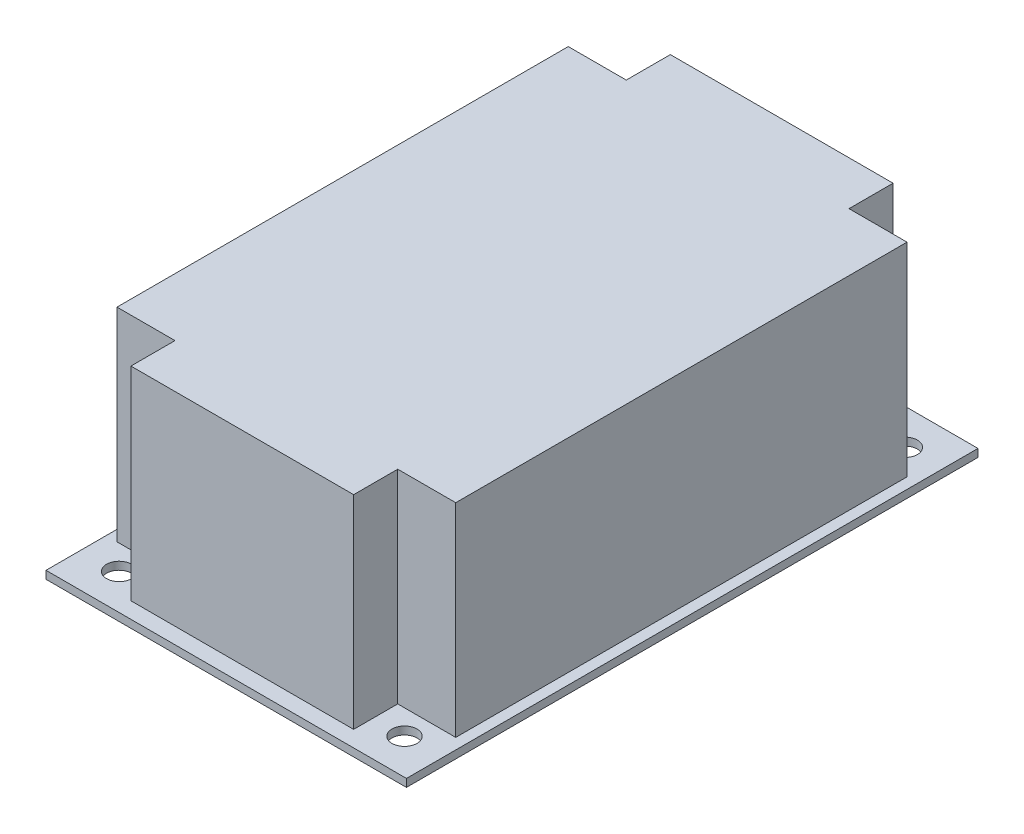
ISO-10303-21;
HEADER;
FILE_DESCRIPTION(('STEP AP214'),'2;1');
FILE_NAME('part.step','',(''),(''),'','','');
FILE_SCHEMA(('AUTOMOTIVE_DESIGN { 1 0 10303 214 1 1 1 1 }'));
ENDSEC;
DATA;
#1=APPLICATION_CONTEXT('core data for automotive mechanical design processes');
#2=APPLICATION_PROTOCOL_DEFINITION('international standard','automotive_design',2000,#1);
#3=PRODUCT_CONTEXT('',#1,'mechanical');
#4=PRODUCT('Part','Part','',(#3));
#5=PRODUCT_RELATED_PRODUCT_CATEGORY('part','',(#4));
#6=PRODUCT_DEFINITION_FORMATION('','',#4);
#7=PRODUCT_DEFINITION_CONTEXT('part definition',#1,'design');
#8=PRODUCT_DEFINITION('design','',#6,#7);
#9=PRODUCT_DEFINITION_SHAPE('','',#8);
#10=(LENGTH_UNIT() NAMED_UNIT(*) SI_UNIT(.MILLI.,.METRE.));
#11=(NAMED_UNIT(*) PLANE_ANGLE_UNIT() SI_UNIT($,.RADIAN.));
#12=(NAMED_UNIT(*) SI_UNIT($,.STERADIAN.) SOLID_ANGLE_UNIT());
#13=UNCERTAINTY_MEASURE_WITH_UNIT(LENGTH_MEASURE(1.E-05),#10,'distance_accuracy_value','');
#14=(GEOMETRIC_REPRESENTATION_CONTEXT(3) GLOBAL_UNCERTAINTY_ASSIGNED_CONTEXT((#13)) GLOBAL_UNIT_ASSIGNED_CONTEXT((#10,
#11,#12)) REPRESENTATION_CONTEXT('',''));
#15=CARTESIAN_POINT('',(0.,0.,0.));
#16=DIRECTION('',(0.,0.,1.));
#17=DIRECTION('',(1.,0.,0.));
#18=AXIS2_PLACEMENT_3D('',#15,#16,#17);
#19=CARTESIAN_POINT('',(23.05,1.,-36.55));
#20=DIRECTION('',(0.,0.,1.));
#21=DIRECTION('',(1.,0.,0.));
#22=AXIS2_PLACEMENT_3D('',#19,#20,#21);
#23=PLANE('',#22);
#24=DIRECTION('',(-1.,0.,0.));
#25=VECTOR('',#24,1.);
#26=CARTESIAN_POINT('',(23.05,0.,-36.55));
#27=LINE('',#26,#25);
#28=CARTESIAN_POINT('',(23.05,0.,-36.55));
#29=VERTEX_POINT('',#28);
#30=CARTESIAN_POINT('',(-23.05,0.,-36.55));
#31=VERTEX_POINT('',#30);
#32=EDGE_CURVE('E207',#29,#31,#27,.T.);
#33=ORIENTED_EDGE('',*,*,#32,.T.);
#34=DIRECTION('',(0.,-1.,0.));
#35=VECTOR('',#34,1.);
#36=CARTESIAN_POINT('',(-23.05,1.,-36.55));
#37=LINE('',#36,#35);
#38=CARTESIAN_POINT('',(-23.05,1.,-36.55));
#39=VERTEX_POINT('',#38);
#40=EDGE_CURVE('E11',#39,#31,#37,.T.);
#41=ORIENTED_EDGE('',*,*,#40,.F.);
#42=DIRECTION('',(-1.,0.,0.));
#43=VECTOR('',#42,1.);
#44=CARTESIAN_POINT('',(23.05,1.,-36.55));
#45=LINE('',#44,#43);
#46=CARTESIAN_POINT('',(23.05,1.,-36.55));
#47=VERTEX_POINT('',#46);
#48=EDGE_CURVE('E210',#47,#39,#45,.T.);
#49=ORIENTED_EDGE('',*,*,#48,.F.);
#50=DIRECTION('',(0.,-1.,0.));
#51=VECTOR('',#50,1.);
#52=CARTESIAN_POINT('',(23.05,1.,-36.55));
#53=LINE('',#52,#51);
#54=EDGE_CURVE('E222',#47,#29,#53,.T.);
#55=ORIENTED_EDGE('',*,*,#54,.T.);
#56=EDGE_LOOP('',(#33,#41,#49,#55));
#57=FACE_BOUND('',#56,.T.);
#58=ADVANCED_FACE('F47',(#57),#23,.F.);
#59=CARTESIAN_POINT('',(-23.05,1.,-36.55));
#60=DIRECTION('',(1.,0.,0.));
#61=DIRECTION('',(0.,0.,-1.));
#62=AXIS2_PLACEMENT_3D('',#59,#60,#61);
#63=PLANE('',#62);
#64=DIRECTION('',(0.,0.,1.));
#65=VECTOR('',#64,1.);
#66=CARTESIAN_POINT('',(-23.05,0.,-36.55));
#67=LINE('',#66,#65);
#68=CARTESIAN_POINT('',(-23.05,0.,36.55));
#69=VERTEX_POINT('',#68);
#70=EDGE_CURVE('E225',#31,#69,#67,.T.);
#71=ORIENTED_EDGE('',*,*,#70,.T.);
#72=DIRECTION('',(0.,-1.,0.));
#73=VECTOR('',#72,1.);
#74=CARTESIAN_POINT('',(-23.05,1.,36.55));
#75=LINE('',#74,#73);
#76=CARTESIAN_POINT('',(-23.05,1.,36.55));
#77=VERTEX_POINT('',#76);
#78=EDGE_CURVE('E54',#77,#69,#75,.T.);
#79=ORIENTED_EDGE('',*,*,#78,.F.);
#80=DIRECTION('',(0.,0.,1.));
#81=VECTOR('',#80,1.);
#82=CARTESIAN_POINT('',(-23.05,1.,-36.55));
#83=LINE('',#82,#81);
#84=EDGE_CURVE('E213',#39,#77,#83,.T.);
#85=ORIENTED_EDGE('',*,*,#84,.F.);
#86=ORIENTED_EDGE('',*,*,#40,.T.);
#87=EDGE_LOOP('',(#71,#79,#85,#86));
#88=FACE_BOUND('',#87,.T.);
#89=ADVANCED_FACE('F241',(#88),#63,.F.);
#90=CARTESIAN_POINT('',(23.05,1.,36.55));
#91=DIRECTION('',(0.,0.,1.));
#92=DIRECTION('',(1.,0.,0.));
#93=AXIS2_PLACEMENT_3D('',#90,#91,#92);
#94=PLANE('',#93);
#95=DIRECTION('',(-1.,0.,0.));
#96=VECTOR('',#95,1.);
#97=CARTESIAN_POINT('',(23.05,0.,36.55));
#98=LINE('',#97,#96);
#99=CARTESIAN_POINT('',(23.05,0.,36.55));
#100=VERTEX_POINT('',#99);
#101=EDGE_CURVE('E228',#100,#69,#98,.T.);
#102=ORIENTED_EDGE('',*,*,#101,.F.);
#103=DIRECTION('',(0.,-1.,0.));
#104=VECTOR('',#103,1.);
#105=CARTESIAN_POINT('',(23.05,1.,36.55));
#106=LINE('',#105,#104);
#107=CARTESIAN_POINT('',(23.05,1.,36.55));
#108=VERTEX_POINT('',#107);
#109=EDGE_CURVE('E234',#108,#100,#106,.T.);
#110=ORIENTED_EDGE('',*,*,#109,.F.);
#111=DIRECTION('',(-1.,0.,0.));
#112=VECTOR('',#111,1.);
#113=CARTESIAN_POINT('',(23.05,1.,36.55));
#114=LINE('',#113,#112);
#115=EDGE_CURVE('E216',#108,#77,#114,.T.);
#116=ORIENTED_EDGE('',*,*,#115,.T.);
#117=ORIENTED_EDGE('',*,*,#78,.T.);
#118=EDGE_LOOP('',(#102,#110,#116,#117));
#119=FACE_BOUND('',#118,.T.);
#120=ADVANCED_FACE('F238',(#119),#94,.T.);
#121=CARTESIAN_POINT('',(23.05,1.,-36.55));
#122=DIRECTION('',(1.,0.,0.));
#123=DIRECTION('',(0.,0.,-1.));
#124=AXIS2_PLACEMENT_3D('',#121,#122,#123);
#125=PLANE('',#124);
#126=DIRECTION('',(0.,0.,1.));
#127=VECTOR('',#126,1.);
#128=CARTESIAN_POINT('',(23.05,0.,-36.55));
#129=LINE('',#128,#127);
#130=EDGE_CURVE('E214',#29,#100,#129,.T.);
#131=ORIENTED_EDGE('',*,*,#130,.F.);
#132=ORIENTED_EDGE('',*,*,#54,.F.);
#133=DIRECTION('',(0.,0.,1.));
#134=VECTOR('',#133,1.);
#135=CARTESIAN_POINT('',(23.05,1.,-36.55));
#136=LINE('',#135,#134);
#137=EDGE_CURVE('E219',#47,#108,#136,.T.);
#138=ORIENTED_EDGE('',*,*,#137,.T.);
#139=ORIENTED_EDGE('',*,*,#109,.T.);
#140=EDGE_LOOP('',(#131,#132,#138,#139));
#141=FACE_BOUND('',#140,.T.);
#142=ADVANCED_FACE('F248',(#141),#125,.T.);
#143=CARTESIAN_POINT('',(0.,1.,0.));
#144=DIRECTION('',(0.,1.,0.));
#145=DIRECTION('',(0.,0.,1.));
#146=AXIS2_PLACEMENT_3D('',#143,#144,#145);
#147=PLANE('',#146);
#148=DIRECTION('',(-1.,0.,0.));
#149=VECTOR('',#148,1.);
#150=CARTESIAN_POINT('',(0.,1.,-28.8579319041342));
#151=LINE('',#150,#149);
#152=CARTESIAN_POINT('',(-14.2435036647655,1.,-28.8579319041342));
#153=VERTEX_POINT('',#152);
#154=CARTESIAN_POINT('',(-21.6619951568308,1.,-28.8579319041342));
#155=VERTEX_POINT('',#154);
#156=EDGE_CURVE('E61',#153,#155,#151,.T.);
#157=ORIENTED_EDGE('',*,*,#156,.F.);
#158=DIRECTION('',(0.,0.,1.));
#159=VECTOR('',#158,1.);
#160=CARTESIAN_POINT('',(-14.2435036647655,1.,0.));
#161=LINE('',#160,#159);
#162=CARTESIAN_POINT('',(-14.2435036647655,1.,-34.4959854381039));
#163=VERTEX_POINT('',#162);
#164=EDGE_CURVE('E65',#163,#153,#161,.T.);
#165=ORIENTED_EDGE('',*,*,#164,.F.);
#166=DIRECTION('',(-1.,0.,0.));
#167=VECTOR('',#166,1.);
#168=CARTESIAN_POINT('',(0.,1.,-34.4959854381039));
#169=LINE('',#168,#167);
#170=CARTESIAN_POINT('',(14.2435036647655,1.,-34.4959854381039));
#171=VERTEX_POINT('',#170);
#172=EDGE_CURVE('E502',#171,#163,#169,.T.);
#173=ORIENTED_EDGE('',*,*,#172,.F.);
#174=DIRECTION('',(0.,0.,1.));
#175=VECTOR('',#174,1.);
#176=CARTESIAN_POINT('',(14.2435036647655,1.,0.));
#177=LINE('',#176,#175);
#178=CARTESIAN_POINT('',(14.2435036647655,1.,-28.8579319041342));
#179=VERTEX_POINT('',#178);
#180=EDGE_CURVE('E555',#171,#179,#177,.T.);
#181=ORIENTED_EDGE('',*,*,#180,.T.);
#182=DIRECTION('',(-1.,0.,0.));
#183=VECTOR('',#182,1.);
#184=CARTESIAN_POINT('',(0.,1.,-28.8579319041342));
#185=LINE('',#184,#183);
#186=CARTESIAN_POINT('',(21.6619951568308,1.,-28.8579319041342));
#187=VERTEX_POINT('',#186);
#188=EDGE_CURVE('E552',#187,#179,#185,.T.);
#189=ORIENTED_EDGE('',*,*,#188,.F.);
#190=DIRECTION('',(0.,0.,1.));
#191=VECTOR('',#190,1.);
#192=CARTESIAN_POINT('',(21.6619951568308,1.,0.));
#193=LINE('',#192,#191);
#194=CARTESIAN_POINT('',(21.6619951568308,1.,28.8579319041342));
#195=VERTEX_POINT('',#194);
#196=EDGE_CURVE('E550',#187,#195,#193,.T.);
#197=ORIENTED_EDGE('',*,*,#196,.T.);
#198=DIRECTION('',(-1.,0.,0.));
#199=VECTOR('',#198,1.);
#200=CARTESIAN_POINT('',(0.,1.,28.8579319041342));
#201=LINE('',#200,#199);
#202=CARTESIAN_POINT('',(14.2435036647655,1.,28.8579319041342));
#203=VERTEX_POINT('',#202);
#204=EDGE_CURVE('E548',#195,#203,#201,.T.);
#205=ORIENTED_EDGE('',*,*,#204,.T.);
#206=DIRECTION('',(0.,0.,1.));
#207=VECTOR('',#206,1.);
#208=CARTESIAN_POINT('',(14.2435036647655,1.,0.));
#209=LINE('',#208,#207);
#210=CARTESIAN_POINT('',(14.2435036647655,1.,34.4959854381039));
#211=VERTEX_POINT('',#210);
#212=EDGE_CURVE('E546',#203,#211,#209,.T.);
#213=ORIENTED_EDGE('',*,*,#212,.T.);
#214=DIRECTION('',(-1.,0.,0.));
#215=VECTOR('',#214,1.);
#216=CARTESIAN_POINT('',(0.,1.,34.4959854381039));
#217=LINE('',#216,#215);
#218=CARTESIAN_POINT('',(-14.2435036647655,1.,34.4959854381039));
#219=VERTEX_POINT('',#218);
#220=EDGE_CURVE('E540',#211,#219,#217,.T.);
#221=ORIENTED_EDGE('',*,*,#220,.T.);
#222=DIRECTION('',(0.,0.,1.));
#223=VECTOR('',#222,1.);
#224=CARTESIAN_POINT('',(-14.2435036647655,1.,0.));
#225=LINE('',#224,#223);
#226=CARTESIAN_POINT('',(-14.2435036647655,1.,28.8579319041342));
#227=VERTEX_POINT('',#226);
#228=EDGE_CURVE('E535',#227,#219,#225,.T.);
#229=ORIENTED_EDGE('',*,*,#228,.F.);
#230=DIRECTION('',(-1.,0.,0.));
#231=VECTOR('',#230,1.);
#232=CARTESIAN_POINT('',(0.,1.,28.8579319041342));
#233=LINE('',#232,#231);
#234=CARTESIAN_POINT('',(-21.6619951568308,1.,28.8579319041342));
#235=VERTEX_POINT('',#234);
#236=EDGE_CURVE('E537',#227,#235,#233,.T.);
#237=ORIENTED_EDGE('',*,*,#236,.T.);
#238=DIRECTION('',(0.,0.,1.));
#239=VECTOR('',#238,1.);
#240=CARTESIAN_POINT('',(-21.6619951568308,1.,0.));
#241=LINE('',#240,#239);
#242=EDGE_CURVE('E538',#155,#235,#241,.T.);
#243=ORIENTED_EDGE('',*,*,#242,.F.);
#244=EDGE_LOOP('',(#157,#165,#173,#181,#189,#197,#205,#213,#221,#229,#237,#243));
#245=FACE_BOUND('',#244,.T.);
#246=CARTESIAN_POINT('',(-18.25,1.,32.));
#247=DIRECTION('',(0.,1.,0.));
#248=DIRECTION('',(0.,0.,1.));
#249=AXIS2_PLACEMENT_3D('',#246,#247,#248);
#250=CIRCLE('',#249,1.6);
#251=CARTESIAN_POINT('',(-18.25,1.,33.6));
#252=VERTEX_POINT('',#251);
#253=EDGE_CURVE('E183',#252,#252,#250,.T.);
#254=ORIENTED_EDGE('',*,*,#253,.F.);
#255=EDGE_LOOP('',(#254));
#256=FACE_BOUND('',#255,.T.);
#257=CARTESIAN_POINT('',(18.25,1.,32.));
#258=DIRECTION('',(0.,1.,0.));
#259=DIRECTION('',(0.,0.,1.));
#260=AXIS2_PLACEMENT_3D('',#257,#258,#259);
#261=CIRCLE('',#260,1.6);
#262=CARTESIAN_POINT('',(18.25,1.,33.6));
#263=VERTEX_POINT('',#262);
#264=EDGE_CURVE('E196',#263,#263,#261,.T.);
#265=ORIENTED_EDGE('',*,*,#264,.F.);
#266=EDGE_LOOP('',(#265));
#267=FACE_BOUND('',#266,.T.);
#268=CARTESIAN_POINT('',(18.25,1.,-32.));
#269=DIRECTION('',(0.,1.,0.));
#270=DIRECTION('',(0.,0.,1.));
#271=AXIS2_PLACEMENT_3D('',#268,#269,#270);
#272=CIRCLE('',#271,1.6);
#273=CARTESIAN_POINT('',(18.25,1.,-30.4));
#274=VERTEX_POINT('',#273);
#275=EDGE_CURVE('E189',#274,#274,#272,.T.);
#276=ORIENTED_EDGE('',*,*,#275,.F.);
#277=EDGE_LOOP('',(#276));
#278=FACE_BOUND('',#277,.T.);
#279=CARTESIAN_POINT('',(-18.25,1.,-32.));
#280=DIRECTION('',(0.,1.,0.));
#281=DIRECTION('',(0.,0.,1.));
#282=AXIS2_PLACEMENT_3D('',#279,#280,#281);
#283=CIRCLE('',#282,1.6);
#284=CARTESIAN_POINT('',(-18.25,1.,-30.4));
#285=VERTEX_POINT('',#284);
#286=EDGE_CURVE('E192',#285,#285,#283,.T.);
#287=ORIENTED_EDGE('',*,*,#286,.F.);
#288=EDGE_LOOP('',(#287));
#289=FACE_BOUND('',#288,.T.);
#290=ORIENTED_EDGE('',*,*,#48,.T.);
#291=ORIENTED_EDGE('',*,*,#84,.T.);
#292=ORIENTED_EDGE('',*,*,#115,.F.);
#293=ORIENTED_EDGE('',*,*,#137,.F.);
#294=EDGE_LOOP('',(#290,#291,#292,#293));
#295=FACE_BOUND('',#294,.T.);
#296=ADVANCED_FACE('F252',(#245,#256,#267,#278,#289,#295),#147,.T.);
#297=CARTESIAN_POINT('',(0.,0.,0.));
#298=DIRECTION('',(0.,1.,0.));
#299=DIRECTION('',(0.,0.,1.));
#300=AXIS2_PLACEMENT_3D('',#297,#298,#299);
#301=PLANE('',#300);
#302=CARTESIAN_POINT('',(-18.25,0.,32.));
#303=DIRECTION('',(0.,1.,0.));
#304=DIRECTION('',(0.,0.,1.));
#305=AXIS2_PLACEMENT_3D('',#302,#303,#304);
#306=CIRCLE('',#305,1.6);
#307=CARTESIAN_POINT('',(-18.25,0.,33.6));
#308=VERTEX_POINT('',#307);
#309=EDGE_CURVE('E180',#308,#308,#306,.T.);
#310=ORIENTED_EDGE('',*,*,#309,.T.);
#311=EDGE_LOOP('',(#310));
#312=FACE_BOUND('',#311,.T.);
#313=CARTESIAN_POINT('',(18.25,0.,32.));
#314=DIRECTION('',(0.,1.,0.));
#315=DIRECTION('',(0.,0.,1.));
#316=AXIS2_PLACEMENT_3D('',#313,#314,#315);
#317=CIRCLE('',#316,1.6);
#318=CARTESIAN_POINT('',(18.25,0.,33.6));
#319=VERTEX_POINT('',#318);
#320=EDGE_CURVE('E199',#319,#319,#317,.T.);
#321=ORIENTED_EDGE('',*,*,#320,.T.);
#322=EDGE_LOOP('',(#321));
#323=FACE_BOUND('',#322,.T.);
#324=CARTESIAN_POINT('',(18.25,0.,-32.));
#325=DIRECTION('',(0.,1.,0.));
#326=DIRECTION('',(0.,0.,1.));
#327=AXIS2_PLACEMENT_3D('',#324,#325,#326);
#328=CIRCLE('',#327,1.6);
#329=CARTESIAN_POINT('',(18.25,0.,-30.4));
#330=VERTEX_POINT('',#329);
#331=EDGE_CURVE('E193',#330,#330,#328,.T.);
#332=ORIENTED_EDGE('',*,*,#331,.T.);
#333=EDGE_LOOP('',(#332));
#334=FACE_BOUND('',#333,.T.);
#335=CARTESIAN_POINT('',(-18.25,0.,-32.));
#336=DIRECTION('',(0.,1.,0.));
#337=DIRECTION('',(0.,0.,1.));
#338=AXIS2_PLACEMENT_3D('',#335,#336,#337);
#339=CIRCLE('',#338,1.6);
#340=CARTESIAN_POINT('',(-18.25,0.,-30.4));
#341=VERTEX_POINT('',#340);
#342=EDGE_CURVE('E204',#341,#341,#339,.T.);
#343=ORIENTED_EDGE('',*,*,#342,.T.);
#344=EDGE_LOOP('',(#343));
#345=FACE_BOUND('',#344,.T.);
#346=ORIENTED_EDGE('',*,*,#32,.F.);
#347=ORIENTED_EDGE('',*,*,#130,.T.);
#348=ORIENTED_EDGE('',*,*,#101,.T.);
#349=ORIENTED_EDGE('',*,*,#70,.F.);
#350=EDGE_LOOP('',(#346,#347,#348,#349));
#351=FACE_BOUND('',#350,.T.);
#352=ADVANCED_FACE('F245',(#312,#323,#334,#345,#351),#301,.F.);
#353=CARTESIAN_POINT('',(-18.25,0.,-32.));
#354=DIRECTION('',(0.,1.,0.));
#355=DIRECTION('',(0.,0.,1.));
#356=AXIS2_PLACEMENT_3D('',#353,#354,#355);
#357=CYLINDRICAL_SURFACE('',#356,1.6);
#358=ORIENTED_EDGE('',*,*,#342,.F.);
#359=EDGE_LOOP('',(#358));
#360=FACE_BOUND('',#359,.T.);
#361=ORIENTED_EDGE('',*,*,#286,.T.);
#362=EDGE_LOOP('',(#361));
#363=FACE_BOUND('',#362,.T.);
#364=ADVANCED_FACE('F267',(#360,#363),#357,.F.);
#365=CARTESIAN_POINT('',(18.25,0.,-32.));
#366=DIRECTION('',(0.,1.,0.));
#367=DIRECTION('',(0.,0.,1.));
#368=AXIS2_PLACEMENT_3D('',#365,#366,#367);
#369=CYLINDRICAL_SURFACE('',#368,1.6);
#370=ORIENTED_EDGE('',*,*,#331,.F.);
#371=EDGE_LOOP('',(#370));
#372=FACE_BOUND('',#371,.T.);
#373=ORIENTED_EDGE('',*,*,#275,.T.);
#374=EDGE_LOOP('',(#373));
#375=FACE_BOUND('',#374,.T.);
#376=ADVANCED_FACE('F273',(#372,#375),#369,.F.);
#377=CARTESIAN_POINT('',(18.25,0.,32.));
#378=DIRECTION('',(0.,1.,0.));
#379=DIRECTION('',(0.,0.,1.));
#380=AXIS2_PLACEMENT_3D('',#377,#378,#379);
#381=CYLINDRICAL_SURFACE('',#380,1.6);
#382=ORIENTED_EDGE('',*,*,#320,.F.);
#383=EDGE_LOOP('',(#382));
#384=FACE_BOUND('',#383,.T.);
#385=ORIENTED_EDGE('',*,*,#264,.T.);
#386=EDGE_LOOP('',(#385));
#387=FACE_BOUND('',#386,.T.);
#388=ADVANCED_FACE('F278',(#384,#387),#381,.F.);
#389=CARTESIAN_POINT('',(-18.25,0.,32.));
#390=DIRECTION('',(0.,1.,0.));
#391=DIRECTION('',(0.,0.,1.));
#392=AXIS2_PLACEMENT_3D('',#389,#390,#391);
#393=CYLINDRICAL_SURFACE('',#392,1.6);
#394=ORIENTED_EDGE('',*,*,#309,.F.);
#395=EDGE_LOOP('',(#394));
#396=FACE_BOUND('',#395,.T.);
#397=ORIENTED_EDGE('',*,*,#253,.T.);
#398=EDGE_LOOP('',(#397));
#399=FACE_BOUND('',#398,.T.);
#400=ADVANCED_FACE('F275',(#396,#399),#393,.F.);
#401=CARTESIAN_POINT('',(0.,27.,-28.8579319041342));
#402=DIRECTION('',(0.,0.,1.));
#403=DIRECTION('',(1.,0.,0.));
#404=AXIS2_PLACEMENT_3D('',#401,#402,#403);
#405=PLANE('',#404);
#406=ORIENTED_EDGE('',*,*,#156,.T.);
#407=DIRECTION('',(0.,-1.,0.));
#408=VECTOR('',#407,1.);
#409=CARTESIAN_POINT('',(-21.6619951568308,27.,-28.8579319041342));
#410=LINE('',#409,#408);
#411=CARTESIAN_POINT('',(-21.6619951568308,27.,-28.8579319041342));
#412=VERTEX_POINT('',#411);
#413=EDGE_CURVE('E162',#412,#155,#410,.T.);
#414=ORIENTED_EDGE('',*,*,#413,.F.);
#415=DIRECTION('',(-1.,0.,0.));
#416=VECTOR('',#415,1.);
#417=CARTESIAN_POINT('',(0.,27.,-28.8579319041342));
#418=LINE('',#417,#416);
#419=CARTESIAN_POINT('',(-14.2435036647655,27.,-28.8579319041342));
#420=VERTEX_POINT('',#419);
#421=EDGE_CURVE('E169',#420,#412,#418,.T.);
#422=ORIENTED_EDGE('',*,*,#421,.F.);
#423=DIRECTION('',(0.,-1.,0.));
#424=VECTOR('',#423,1.);
#425=CARTESIAN_POINT('',(-14.2435036647655,27.,-28.8579319041342));
#426=LINE('',#425,#424);
#427=EDGE_CURVE('E499',#420,#153,#426,.T.);
#428=ORIENTED_EDGE('',*,*,#427,.T.);
#429=EDGE_LOOP('',(#406,#414,#422,#428));
#430=FACE_BOUND('',#429,.T.);
#431=ADVANCED_FACE('F179',(#430),#405,.F.);
#432=CARTESIAN_POINT('',(-21.6619951568308,27.,0.));
#433=DIRECTION('',(1.,0.,0.));
#434=DIRECTION('',(0.,0.,-1.));
#435=AXIS2_PLACEMENT_3D('',#432,#433,#434);
#436=PLANE('',#435);
#437=ORIENTED_EDGE('',*,*,#242,.T.);
#438=DIRECTION('',(0.,-1.,0.));
#439=VECTOR('',#438,1.);
#440=CARTESIAN_POINT('',(-21.6619951568308,27.,28.8579319041342));
#441=LINE('',#440,#439);
#442=CARTESIAN_POINT('',(-21.6619951568308,27.,28.8579319041342));
#443=VERTEX_POINT('',#442);
#444=EDGE_CURVE('E164',#443,#235,#441,.T.);
#445=ORIENTED_EDGE('',*,*,#444,.F.);
#446=DIRECTION('',(0.,0.,1.));
#447=VECTOR('',#446,1.);
#448=CARTESIAN_POINT('',(-21.6619951568308,27.,0.));
#449=LINE('',#448,#447);
#450=EDGE_CURVE('E157',#412,#443,#449,.T.);
#451=ORIENTED_EDGE('',*,*,#450,.F.);
#452=ORIENTED_EDGE('',*,*,#413,.T.);
#453=EDGE_LOOP('',(#437,#445,#451,#452));
#454=FACE_BOUND('',#453,.T.);
#455=ADVANCED_FACE('F160',(#454),#436,.F.);
#456=CARTESIAN_POINT('',(0.,27.,28.8579319041342));
#457=DIRECTION('',(0.,0.,1.));
#458=DIRECTION('',(1.,0.,0.));
#459=AXIS2_PLACEMENT_3D('',#456,#457,#458);
#460=PLANE('',#459);
#461=ORIENTED_EDGE('',*,*,#236,.F.);
#462=DIRECTION('',(0.,-1.,0.));
#463=VECTOR('',#462,1.);
#464=CARTESIAN_POINT('',(-14.2435036647655,27.,28.8579319041342));
#465=LINE('',#464,#463);
#466=CARTESIAN_POINT('',(-14.2435036647655,27.,28.8579319041342));
#467=VERTEX_POINT('',#466);
#468=EDGE_CURVE('E185',#467,#227,#465,.T.);
#469=ORIENTED_EDGE('',*,*,#468,.F.);
#470=DIRECTION('',(-1.,0.,0.));
#471=VECTOR('',#470,1.);
#472=CARTESIAN_POINT('',(0.,27.,28.8579319041342));
#473=LINE('',#472,#471);
#474=EDGE_CURVE('E168',#467,#443,#473,.T.);
#475=ORIENTED_EDGE('',*,*,#474,.T.);
#476=ORIENTED_EDGE('',*,*,#444,.T.);
#477=EDGE_LOOP('',(#461,#469,#475,#476));
#478=FACE_BOUND('',#477,.T.);
#479=ADVANCED_FACE('F290',(#478),#460,.T.);
#480=CARTESIAN_POINT('',(-14.2435036647655,27.,0.));
#481=DIRECTION('',(1.,0.,0.));
#482=DIRECTION('',(0.,0.,-1.));
#483=AXIS2_PLACEMENT_3D('',#480,#481,#482);
#484=PLANE('',#483);
#485=ORIENTED_EDGE('',*,*,#228,.T.);
#486=DIRECTION('',(0.,-1.,0.));
#487=VECTOR('',#486,1.);
#488=CARTESIAN_POINT('',(-14.2435036647655,27.,34.4959854381039));
#489=LINE('',#488,#487);
#490=CARTESIAN_POINT('',(-14.2435036647655,27.,34.4959854381039));
#491=VERTEX_POINT('',#490);
#492=EDGE_CURVE('E528',#491,#219,#489,.T.);
#493=ORIENTED_EDGE('',*,*,#492,.F.);
#494=DIRECTION('',(0.,0.,1.));
#495=VECTOR('',#494,1.);
#496=CARTESIAN_POINT('',(-14.2435036647655,27.,0.));
#497=LINE('',#496,#495);
#498=EDGE_CURVE('E536',#467,#491,#497,.T.);
#499=ORIENTED_EDGE('',*,*,#498,.F.);
#500=ORIENTED_EDGE('',*,*,#468,.T.);
#501=EDGE_LOOP('',(#485,#493,#499,#500));
#502=FACE_BOUND('',#501,.T.);
#503=ADVANCED_FACE('F293',(#502),#484,.F.);
#504=CARTESIAN_POINT('',(0.,27.,34.4959854381039));
#505=DIRECTION('',(0.,0.,1.));
#506=DIRECTION('',(1.,0.,0.));
#507=AXIS2_PLACEMENT_3D('',#504,#505,#506);
#508=PLANE('',#507);
#509=ORIENTED_EDGE('',*,*,#220,.F.);
#510=DIRECTION('',(0.,-1.,0.));
#511=VECTOR('',#510,1.);
#512=CARTESIAN_POINT('',(14.2435036647655,27.,34.4959854381039));
#513=LINE('',#512,#511);
#514=CARTESIAN_POINT('',(14.2435036647655,27.,34.4959854381039));
#515=VERTEX_POINT('',#514);
#516=EDGE_CURVE('E525',#515,#211,#513,.T.);
#517=ORIENTED_EDGE('',*,*,#516,.F.);
#518=DIRECTION('',(-1.,0.,0.));
#519=VECTOR('',#518,1.);
#520=CARTESIAN_POINT('',(0.,27.,34.4959854381039));
#521=LINE('',#520,#519);
#522=EDGE_CURVE('E579',#515,#491,#521,.T.);
#523=ORIENTED_EDGE('',*,*,#522,.T.);
#524=ORIENTED_EDGE('',*,*,#492,.T.);
#525=EDGE_LOOP('',(#509,#517,#523,#524));
#526=FACE_BOUND('',#525,.T.);
#527=ADVANCED_FACE('F297',(#526),#508,.T.);
#528=CARTESIAN_POINT('',(14.2435036647655,27.,0.));
#529=DIRECTION('',(1.,0.,0.));
#530=DIRECTION('',(0.,0.,-1.));
#531=AXIS2_PLACEMENT_3D('',#528,#529,#530);
#532=PLANE('',#531);
#533=ORIENTED_EDGE('',*,*,#212,.F.);
#534=DIRECTION('',(0.,-1.,0.));
#535=VECTOR('',#534,1.);
#536=CARTESIAN_POINT('',(14.2435036647655,27.,28.8579319041342));
#537=LINE('',#536,#535);
#538=CARTESIAN_POINT('',(14.2435036647655,27.,28.8579319041342));
#539=VERTEX_POINT('',#538);
#540=EDGE_CURVE('E522',#539,#203,#537,.T.);
#541=ORIENTED_EDGE('',*,*,#540,.F.);
#542=DIRECTION('',(0.,0.,1.));
#543=VECTOR('',#542,1.);
#544=CARTESIAN_POINT('',(14.2435036647655,27.,0.));
#545=LINE('',#544,#543);
#546=EDGE_CURVE('E576',#539,#515,#545,.T.);
#547=ORIENTED_EDGE('',*,*,#546,.T.);
#548=ORIENTED_EDGE('',*,*,#516,.T.);
#549=EDGE_LOOP('',(#533,#541,#547,#548));
#550=FACE_BOUND('',#549,.T.);
#551=ADVANCED_FACE('F301',(#550),#532,.T.);
#552=CARTESIAN_POINT('',(0.,27.,28.8579319041342));
#553=DIRECTION('',(0.,0.,1.));
#554=DIRECTION('',(1.,0.,0.));
#555=AXIS2_PLACEMENT_3D('',#552,#553,#554);
#556=PLANE('',#555);
#557=ORIENTED_EDGE('',*,*,#204,.F.);
#558=DIRECTION('',(0.,-1.,0.));
#559=VECTOR('',#558,1.);
#560=CARTESIAN_POINT('',(21.6619951568308,27.,28.8579319041342));
#561=LINE('',#560,#559);
#562=CARTESIAN_POINT('',(21.6619951568308,27.,28.8579319041342));
#563=VERTEX_POINT('',#562);
#564=EDGE_CURVE('E519',#563,#195,#561,.T.);
#565=ORIENTED_EDGE('',*,*,#564,.F.);
#566=DIRECTION('',(-1.,0.,0.));
#567=VECTOR('',#566,1.);
#568=CARTESIAN_POINT('',(0.,27.,28.8579319041342));
#569=LINE('',#568,#567);
#570=EDGE_CURVE('E572',#563,#539,#569,.T.);
#571=ORIENTED_EDGE('',*,*,#570,.T.);
#572=ORIENTED_EDGE('',*,*,#540,.T.);
#573=EDGE_LOOP('',(#557,#565,#571,#572));
#574=FACE_BOUND('',#573,.T.);
#575=ADVANCED_FACE('F305',(#574),#556,.T.);
#576=CARTESIAN_POINT('',(21.6619951568308,27.,0.));
#577=DIRECTION('',(1.,0.,0.));
#578=DIRECTION('',(0.,0.,-1.));
#579=AXIS2_PLACEMENT_3D('',#576,#577,#578);
#580=PLANE('',#579);
#581=ORIENTED_EDGE('',*,*,#196,.F.);
#582=DIRECTION('',(0.,-1.,0.));
#583=VECTOR('',#582,1.);
#584=CARTESIAN_POINT('',(21.6619951568308,27.,-28.8579319041342));
#585=LINE('',#584,#583);
#586=CARTESIAN_POINT('',(21.6619951568308,27.,-28.8579319041342));
#587=VERTEX_POINT('',#586);
#588=EDGE_CURVE('E516',#587,#187,#585,.T.);
#589=ORIENTED_EDGE('',*,*,#588,.F.);
#590=DIRECTION('',(0.,0.,1.));
#591=VECTOR('',#590,1.);
#592=CARTESIAN_POINT('',(21.6619951568308,27.,0.));
#593=LINE('',#592,#591);
#594=EDGE_CURVE('E586',#587,#563,#593,.T.);
#595=ORIENTED_EDGE('',*,*,#594,.T.);
#596=ORIENTED_EDGE('',*,*,#564,.T.);
#597=EDGE_LOOP('',(#581,#589,#595,#596));
#598=FACE_BOUND('',#597,.T.);
#599=ADVANCED_FACE('F309',(#598),#580,.T.);
#600=CARTESIAN_POINT('',(0.,27.,-28.8579319041342));
#601=DIRECTION('',(0.,0.,1.));
#602=DIRECTION('',(1.,0.,0.));
#603=AXIS2_PLACEMENT_3D('',#600,#601,#602);
#604=PLANE('',#603);
#605=ORIENTED_EDGE('',*,*,#188,.T.);
#606=DIRECTION('',(0.,-1.,0.));
#607=VECTOR('',#606,1.);
#608=CARTESIAN_POINT('',(14.2435036647655,27.,-28.8579319041342));
#609=LINE('',#608,#607);
#610=CARTESIAN_POINT('',(14.2435036647655,27.,-28.8579319041342));
#611=VERTEX_POINT('',#610);
#612=EDGE_CURVE('E513',#611,#179,#609,.T.);
#613=ORIENTED_EDGE('',*,*,#612,.F.);
#614=DIRECTION('',(-1.,0.,0.));
#615=VECTOR('',#614,1.);
#616=CARTESIAN_POINT('',(0.,27.,-28.8579319041342));
#617=LINE('',#616,#615);
#618=EDGE_CURVE('E565',#587,#611,#617,.T.);
#619=ORIENTED_EDGE('',*,*,#618,.F.);
#620=ORIENTED_EDGE('',*,*,#588,.T.);
#621=EDGE_LOOP('',(#605,#613,#619,#620));
#622=FACE_BOUND('',#621,.T.);
#623=ADVANCED_FACE('F313',(#622),#604,.F.);
#624=CARTESIAN_POINT('',(14.2435036647655,27.,0.));
#625=DIRECTION('',(1.,0.,0.));
#626=DIRECTION('',(0.,0.,-1.));
#627=AXIS2_PLACEMENT_3D('',#624,#625,#626);
#628=PLANE('',#627);
#629=ORIENTED_EDGE('',*,*,#180,.F.);
#630=DIRECTION('',(0.,-1.,0.));
#631=VECTOR('',#630,1.);
#632=CARTESIAN_POINT('',(14.2435036647655,27.,-34.4959854381039));
#633=LINE('',#632,#631);
#634=CARTESIAN_POINT('',(14.2435036647655,27.,-34.4959854381039));
#635=VERTEX_POINT('',#634);
#636=EDGE_CURVE('E505',#635,#171,#633,.T.);
#637=ORIENTED_EDGE('',*,*,#636,.F.);
#638=DIRECTION('',(0.,0.,1.));
#639=VECTOR('',#638,1.);
#640=CARTESIAN_POINT('',(14.2435036647655,27.,0.));
#641=LINE('',#640,#639);
#642=EDGE_CURVE('E562',#635,#611,#641,.T.);
#643=ORIENTED_EDGE('',*,*,#642,.T.);
#644=ORIENTED_EDGE('',*,*,#612,.T.);
#645=EDGE_LOOP('',(#629,#637,#643,#644));
#646=FACE_BOUND('',#645,.T.);
#647=ADVANCED_FACE('F317',(#646),#628,.T.);
#648=CARTESIAN_POINT('',(0.,27.,-34.4959854381039));
#649=DIRECTION('',(0.,0.,1.));
#650=DIRECTION('',(1.,0.,0.));
#651=AXIS2_PLACEMENT_3D('',#648,#649,#650);
#652=PLANE('',#651);
#653=ORIENTED_EDGE('',*,*,#172,.T.);
#654=DIRECTION('',(0.,-1.,0.));
#655=VECTOR('',#654,1.);
#656=CARTESIAN_POINT('',(-14.2435036647655,27.,-34.4959854381039));
#657=LINE('',#656,#655);
#658=CARTESIAN_POINT('',(-14.2435036647655,27.,-34.4959854381039));
#659=VERTEX_POINT('',#658);
#660=EDGE_CURVE('E501',#659,#163,#657,.T.);
#661=ORIENTED_EDGE('',*,*,#660,.F.);
#662=DIRECTION('',(-1.,0.,0.));
#663=VECTOR('',#662,1.);
#664=CARTESIAN_POINT('',(0.,27.,-34.4959854381039));
#665=LINE('',#664,#663);
#666=EDGE_CURVE('E507',#635,#659,#665,.T.);
#667=ORIENTED_EDGE('',*,*,#666,.F.);
#668=ORIENTED_EDGE('',*,*,#636,.T.);
#669=EDGE_LOOP('',(#653,#661,#667,#668));
#670=FACE_BOUND('',#669,.T.);
#671=ADVANCED_FACE('F321',(#670),#652,.F.);
#672=CARTESIAN_POINT('',(-14.2435036647655,27.,0.));
#673=DIRECTION('',(1.,0.,0.));
#674=DIRECTION('',(0.,0.,-1.));
#675=AXIS2_PLACEMENT_3D('',#672,#673,#674);
#676=PLANE('',#675);
#677=ORIENTED_EDGE('',*,*,#164,.T.);
#678=ORIENTED_EDGE('',*,*,#427,.F.);
#679=DIRECTION('',(0.,0.,1.));
#680=VECTOR('',#679,1.);
#681=CARTESIAN_POINT('',(-14.2435036647655,27.,0.));
#682=LINE('',#681,#680);
#683=EDGE_CURVE('E174',#659,#420,#682,.T.);
#684=ORIENTED_EDGE('',*,*,#683,.F.);
#685=ORIENTED_EDGE('',*,*,#660,.T.);
#686=EDGE_LOOP('',(#677,#678,#684,#685));
#687=FACE_BOUND('',#686,.T.);
#688=ADVANCED_FACE('F325',(#687),#676,.F.);
#689=CARTESIAN_POINT('',(0.,27.,0.));
#690=DIRECTION('',(0.,1.,0.));
#691=DIRECTION('',(0.,0.,1.));
#692=AXIS2_PLACEMENT_3D('',#689,#690,#691);
#693=PLANE('',#692);
#694=ORIENTED_EDGE('',*,*,#421,.T.);
#695=ORIENTED_EDGE('',*,*,#450,.T.);
#696=ORIENTED_EDGE('',*,*,#474,.F.);
#697=ORIENTED_EDGE('',*,*,#498,.T.);
#698=ORIENTED_EDGE('',*,*,#522,.F.);
#699=ORIENTED_EDGE('',*,*,#546,.F.);
#700=ORIENTED_EDGE('',*,*,#570,.F.);
#701=ORIENTED_EDGE('',*,*,#594,.F.);
#702=ORIENTED_EDGE('',*,*,#618,.T.);
#703=ORIENTED_EDGE('',*,*,#642,.F.);
#704=ORIENTED_EDGE('',*,*,#666,.T.);
#705=ORIENTED_EDGE('',*,*,#683,.T.);
#706=EDGE_LOOP('',(#694,#695,#696,#697,#698,#699,#700,#701,#702,#703,#704,#705));
#707=FACE_BOUND('',#706,.T.);
#708=ADVANCED_FACE('F172',(#707),#693,.T.);
#709=CLOSED_SHELL('',(#58,#89,#120,#142,#296,#352,#364,#376,#388,#400,#431,#455,#479,#503,#527,
#551,#575,#599,#623,#647,#671,#688,#708));
#710=MANIFOLD_SOLID_BREP('B2',#709);
#711=ADVANCED_BREP_SHAPE_REPRESENTATION('',(#18,#710),#14);
#712=SHAPE_DEFINITION_REPRESENTATION(#9,#711);
ENDSEC;
END-ISO-10303-21;
